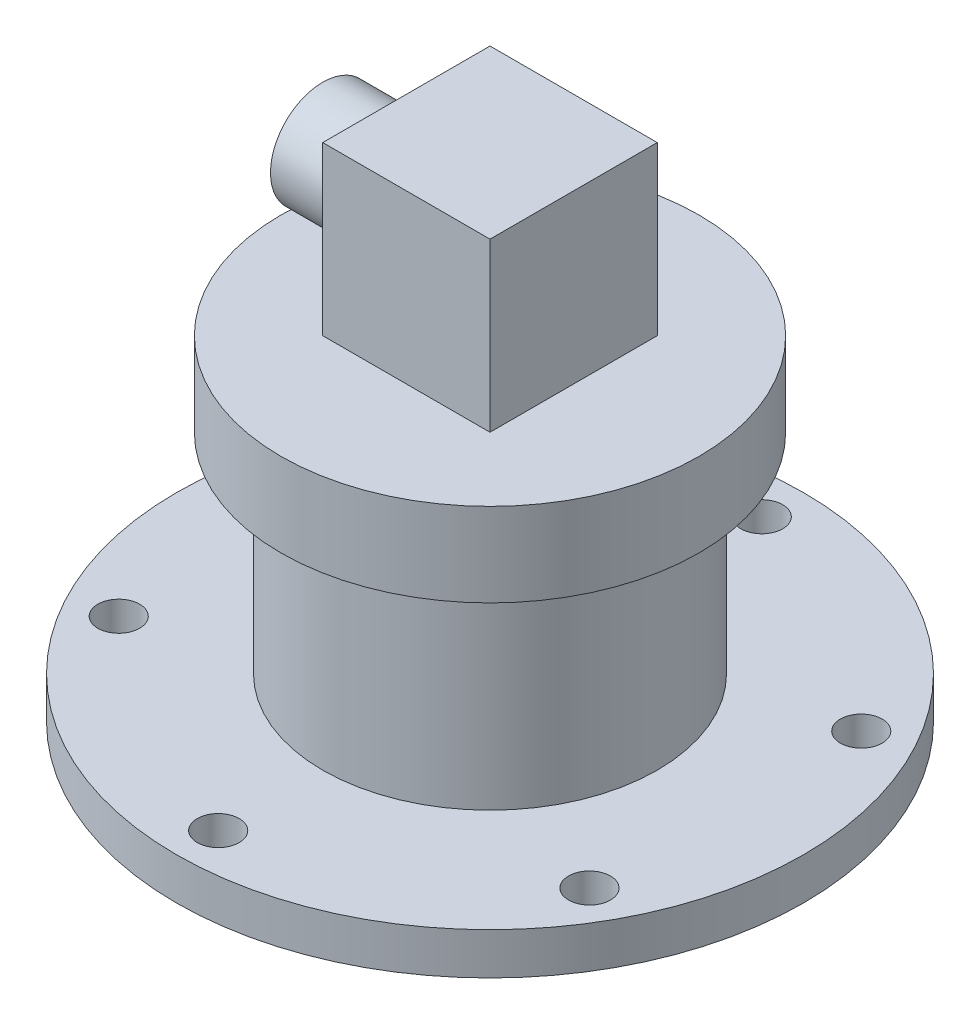
ISO-10303-21;
HEADER;
FILE_DESCRIPTION(('STEP AP214'),'2;1');
FILE_NAME('part.step','',(''),(''),'','','');
FILE_SCHEMA(('AUTOMOTIVE_DESIGN { 1 0 10303 214 1 1 1 1 }'));
ENDSEC;
DATA;
#1=APPLICATION_CONTEXT('core data for automotive mechanical design processes');
#2=APPLICATION_PROTOCOL_DEFINITION('international standard','automotive_design',2000,#1);
#3=PRODUCT_CONTEXT('',#1,'mechanical');
#4=PRODUCT('Part','Part','',(#3));
#5=PRODUCT_RELATED_PRODUCT_CATEGORY('part','',(#4));
#6=PRODUCT_DEFINITION_FORMATION('','',#4);
#7=PRODUCT_DEFINITION_CONTEXT('part definition',#1,'design');
#8=PRODUCT_DEFINITION('design','',#6,#7);
#9=PRODUCT_DEFINITION_SHAPE('','',#8);
#10=(LENGTH_UNIT() NAMED_UNIT(*) SI_UNIT(.MILLI.,.METRE.));
#11=(NAMED_UNIT(*) PLANE_ANGLE_UNIT() SI_UNIT($,.RADIAN.));
#12=(NAMED_UNIT(*) SI_UNIT($,.STERADIAN.) SOLID_ANGLE_UNIT());
#13=UNCERTAINTY_MEASURE_WITH_UNIT(LENGTH_MEASURE(1.E-05),#10,'distance_accuracy_value','');
#14=(GEOMETRIC_REPRESENTATION_CONTEXT(3) GLOBAL_UNCERTAINTY_ASSIGNED_CONTEXT((#13)) GLOBAL_UNIT_ASSIGNED_CONTEXT((#10,
#11,#12)) REPRESENTATION_CONTEXT('',''));
#15=CARTESIAN_POINT('',(0.,0.,0.));
#16=DIRECTION('',(0.,0.,1.));
#17=DIRECTION('',(1.,0.,0.));
#18=AXIS2_PLACEMENT_3D('',#15,#16,#17);
#19=CARTESIAN_POINT('',(0.,10.,0.));
#20=DIRECTION('',(0.,-1.,0.));
#21=DIRECTION('',(0.,0.,-1.));
#22=AXIS2_PLACEMENT_3D('',#19,#20,#21);
#23=CYLINDRICAL_SURFACE('',#22,75.);
#24=CARTESIAN_POINT('',(0.,10.,0.));
#25=DIRECTION('',(0.,1.,0.));
#26=DIRECTION('',(0.,0.,1.));
#27=AXIS2_PLACEMENT_3D('',#24,#25,#26);
#28=CIRCLE('',#27,75.);
#29=CARTESIAN_POINT('',(0.,10.,75.));
#30=VERTEX_POINT('',#29);
#31=EDGE_CURVE('E40',#30,#30,#28,.T.);
#32=ORIENTED_EDGE('',*,*,#31,.F.);
#33=EDGE_LOOP('',(#32));
#34=FACE_BOUND('',#33,.T.);
#35=CARTESIAN_POINT('',(0.,0.,0.));
#36=DIRECTION('',(0.,1.,0.));
#37=DIRECTION('',(0.,0.,1.));
#38=AXIS2_PLACEMENT_3D('',#35,#36,#37);
#39=CIRCLE('',#38,75.);
#40=CARTESIAN_POINT('',(0.,0.,75.));
#41=VERTEX_POINT('',#40);
#42=EDGE_CURVE('E114',#41,#41,#39,.T.);
#43=ORIENTED_EDGE('',*,*,#42,.T.);
#44=EDGE_LOOP('',(#43));
#45=FACE_BOUND('',#44,.T.);
#46=ADVANCED_FACE('F33',(#34,#45),#23,.T.);
#47=CARTESIAN_POINT('',(0.,10.,0.));
#48=DIRECTION('',(0.,1.,0.));
#49=DIRECTION('',(0.,0.,1.));
#50=AXIS2_PLACEMENT_3D('',#47,#48,#49);
#51=PLANE('',#50);
#52=CARTESIAN_POINT('',(0.,10.,0.));
#53=DIRECTION('',(0.,1.,0.));
#54=DIRECTION('',(0.,0.,1.));
#55=AXIS2_PLACEMENT_3D('',#52,#53,#54);
#56=CIRCLE('',#55,40.);
#57=CARTESIAN_POINT('',(0.,10.,40.));
#58=VERTEX_POINT('',#57);
#59=EDGE_CURVE('E103',#58,#58,#56,.T.);
#60=ORIENTED_EDGE('',*,*,#59,.F.);
#61=EDGE_LOOP('',(#60));
#62=FACE_BOUND('',#61,.T.);
#63=CARTESIAN_POINT('',(0.,10.,-65.));
#64=DIRECTION('',(0.,1.,0.));
#65=DIRECTION('',(0.,0.,1.));
#66=AXIS2_PLACEMENT_3D('',#63,#64,#65);
#67=CIRCLE('',#66,5.);
#68=CARTESIAN_POINT('',(0.,10.,-60.));
#69=VERTEX_POINT('',#68);
#70=EDGE_CURVE('E115',#69,#69,#67,.T.);
#71=ORIENTED_EDGE('',*,*,#70,.F.);
#72=EDGE_LOOP('',(#71));
#73=FACE_BOUND('',#72,.T.);
#74=CARTESIAN_POINT('',(-56.2916512459872,10.,-32.4999999999976));
#75=DIRECTION('',(0.,1.,0.));
#76=DIRECTION('',(0.,0.,1.));
#77=AXIS2_PLACEMENT_3D('',#74,#75,#76);
#78=CIRCLE('',#77,5.00000000000279);
#79=CARTESIAN_POINT('',(-56.2916512459872,10.,-27.4999999999948));
#80=VERTEX_POINT('',#79);
#81=EDGE_CURVE('E108',#80,#80,#78,.T.);
#82=ORIENTED_EDGE('',*,*,#81,.F.);
#83=EDGE_LOOP('',(#82));
#84=FACE_BOUND('',#83,.T.);
#85=CARTESIAN_POINT('',(-56.2916512459844,10.,32.5000000000024));
#86=DIRECTION('',(0.,1.,0.));
#87=DIRECTION('',(0.,0.,1.));
#88=AXIS2_PLACEMENT_3D('',#85,#86,#87);
#89=CIRCLE('',#88,5.00000000000526);
#90=CARTESIAN_POINT('',(-56.2916512459844,10.,37.5000000000077));
#91=VERTEX_POINT('',#90);
#92=EDGE_CURVE('E122',#91,#91,#89,.T.);
#93=ORIENTED_EDGE('',*,*,#92,.F.);
#94=EDGE_LOOP('',(#93));
#95=FACE_BOUND('',#94,.T.);
#96=CARTESIAN_POINT('',(5.51835272634541E-12,10.,65.));
#97=DIRECTION('',(0.,1.,0.));
#98=DIRECTION('',(0.,0.,1.));
#99=AXIS2_PLACEMENT_3D('',#96,#97,#98);
#100=CIRCLE('',#99,5.00000000000572);
#101=CARTESIAN_POINT('',(5.51835272634541E-12,10.,70.0000000000057));
#102=VERTEX_POINT('',#101);
#103=EDGE_CURVE('E139',#102,#102,#100,.T.);
#104=ORIENTED_EDGE('',*,*,#103,.F.);
#105=EDGE_LOOP('',(#104));
#106=FACE_BOUND('',#105,.T.);
#107=CARTESIAN_POINT('',(56.2916512459927,10.,32.4999999999976));
#108=DIRECTION('',(0.,1.,0.));
#109=DIRECTION('',(0.,0.,1.));
#110=AXIS2_PLACEMENT_3D('',#107,#108,#109);
#111=CIRCLE('',#110,5.00000000000356);
#112=CARTESIAN_POINT('',(56.2916512459927,10.,37.5000000000012));
#113=VERTEX_POINT('',#112);
#114=EDGE_CURVE('E133',#113,#113,#111,.T.);
#115=ORIENTED_EDGE('',*,*,#114,.F.);
#116=EDGE_LOOP('',(#115));
#117=FACE_BOUND('',#116,.T.);
#118=CARTESIAN_POINT('',(56.2916512459899,10.,-32.5000000000024));
#119=DIRECTION('',(0.,1.,0.));
#120=DIRECTION('',(0.,0.,1.));
#121=AXIS2_PLACEMENT_3D('',#118,#119,#120);
#122=CIRCLE('',#121,5.00000000000078);
#123=CARTESIAN_POINT('',(56.2916512459899,10.,-27.5000000000016));
#124=VERTEX_POINT('',#123);
#125=EDGE_CURVE('E127',#124,#124,#122,.T.);
#126=ORIENTED_EDGE('',*,*,#125,.F.);
#127=EDGE_LOOP('',(#126));
#128=FACE_BOUND('',#127,.T.);
#129=ORIENTED_EDGE('',*,*,#31,.T.);
#130=EDGE_LOOP('',(#129));
#131=FACE_BOUND('',#130,.T.);
#132=ADVANCED_FACE('F155',(#62,#73,#84,#95,#106,#117,#128,#131),#51,.T.);
#133=CARTESIAN_POINT('',(0.,0.,0.));
#134=DIRECTION('',(0.,1.,0.));
#135=DIRECTION('',(0.,0.,1.));
#136=AXIS2_PLACEMENT_3D('',#133,#134,#135);
#137=PLANE('',#136);
#138=CARTESIAN_POINT('',(0.,0.,-65.));
#139=DIRECTION('',(0.,1.,0.));
#140=DIRECTION('',(0.,0.,1.));
#141=AXIS2_PLACEMENT_3D('',#138,#139,#140);
#142=CIRCLE('',#141,5.);
#143=CARTESIAN_POINT('',(0.,0.,-60.));
#144=VERTEX_POINT('',#143);
#145=EDGE_CURVE('E111',#144,#144,#142,.T.);
#146=ORIENTED_EDGE('',*,*,#145,.T.);
#147=EDGE_LOOP('',(#146));
#148=FACE_BOUND('',#147,.T.);
#149=CARTESIAN_POINT('',(-56.2916512459872,0.,-32.4999999999976));
#150=DIRECTION('',(0.,1.,0.));
#151=DIRECTION('',(0.,0.,1.));
#152=AXIS2_PLACEMENT_3D('',#149,#150,#151);
#153=CIRCLE('',#152,5.00000000000279);
#154=CARTESIAN_POINT('',(-56.2916512459872,0.,-27.4999999999948));
#155=VERTEX_POINT('',#154);
#156=EDGE_CURVE('E119',#155,#155,#153,.T.);
#157=ORIENTED_EDGE('',*,*,#156,.T.);
#158=EDGE_LOOP('',(#157));
#159=FACE_BOUND('',#158,.T.);
#160=CARTESIAN_POINT('',(-56.2916512459844,0.,32.5000000000024));
#161=DIRECTION('',(0.,1.,0.));
#162=DIRECTION('',(0.,0.,1.));
#163=AXIS2_PLACEMENT_3D('',#160,#161,#162);
#164=CIRCLE('',#163,5.00000000000526);
#165=CARTESIAN_POINT('',(-56.2916512459844,0.,37.5000000000077));
#166=VERTEX_POINT('',#165);
#167=EDGE_CURVE('E142',#166,#166,#164,.T.);
#168=ORIENTED_EDGE('',*,*,#167,.T.);
#169=EDGE_LOOP('',(#168));
#170=FACE_BOUND('',#169,.T.);
#171=CARTESIAN_POINT('',(5.51835272634541E-12,0.,65.));
#172=DIRECTION('',(0.,1.,0.));
#173=DIRECTION('',(0.,0.,1.));
#174=AXIS2_PLACEMENT_3D('',#171,#172,#173);
#175=CIRCLE('',#174,5.00000000000572);
#176=CARTESIAN_POINT('',(5.51835272634541E-12,0.,70.0000000000057));
#177=VERTEX_POINT('',#176);
#178=EDGE_CURVE('E136',#177,#177,#175,.T.);
#179=ORIENTED_EDGE('',*,*,#178,.T.);
#180=EDGE_LOOP('',(#179));
#181=FACE_BOUND('',#180,.T.);
#182=CARTESIAN_POINT('',(56.2916512459927,0.,32.4999999999976));
#183=DIRECTION('',(0.,1.,0.));
#184=DIRECTION('',(0.,0.,1.));
#185=AXIS2_PLACEMENT_3D('',#182,#183,#184);
#186=CIRCLE('',#185,5.00000000000356);
#187=CARTESIAN_POINT('',(56.2916512459927,0.,37.5000000000012));
#188=VERTEX_POINT('',#187);
#189=EDGE_CURVE('E130',#188,#188,#186,.T.);
#190=ORIENTED_EDGE('',*,*,#189,.T.);
#191=EDGE_LOOP('',(#190));
#192=FACE_BOUND('',#191,.T.);
#193=CARTESIAN_POINT('',(56.2916512459899,0.,-32.5000000000024));
#194=DIRECTION('',(0.,1.,0.));
#195=DIRECTION('',(0.,0.,1.));
#196=AXIS2_PLACEMENT_3D('',#193,#194,#195);
#197=CIRCLE('',#196,5.00000000000078);
#198=CARTESIAN_POINT('',(56.2916512459899,0.,-27.5000000000016));
#199=VERTEX_POINT('',#198);
#200=EDGE_CURVE('E118',#199,#199,#197,.T.);
#201=ORIENTED_EDGE('',*,*,#200,.T.);
#202=EDGE_LOOP('',(#201));
#203=FACE_BOUND('',#202,.T.);
#204=ORIENTED_EDGE('',*,*,#42,.F.);
#205=EDGE_LOOP('',(#204));
#206=FACE_BOUND('',#205,.T.);
#207=ADVANCED_FACE('F152',(#148,#159,#170,#181,#192,#203,#206),#137,.F.);
#208=CARTESIAN_POINT('',(56.2916512459899,0.,-32.5000000000024));
#209=DIRECTION('',(0.,1.,0.));
#210=DIRECTION('',(0.,0.,1.));
#211=AXIS2_PLACEMENT_3D('',#208,#209,#210);
#212=CYLINDRICAL_SURFACE('',#211,5.00000000000078);
#213=ORIENTED_EDGE('',*,*,#200,.F.);
#214=EDGE_LOOP('',(#213));
#215=FACE_BOUND('',#214,.T.);
#216=ORIENTED_EDGE('',*,*,#125,.T.);
#217=EDGE_LOOP('',(#216));
#218=FACE_BOUND('',#217,.T.);
#219=ADVANCED_FACE('F154',(#215,#218),#212,.F.);
#220=CARTESIAN_POINT('',(56.2916512459927,0.,32.4999999999976));
#221=DIRECTION('',(0.,1.,0.));
#222=DIRECTION('',(0.,0.,1.));
#223=AXIS2_PLACEMENT_3D('',#220,#221,#222);
#224=CYLINDRICAL_SURFACE('',#223,5.00000000000356);
#225=ORIENTED_EDGE('',*,*,#189,.F.);
#226=EDGE_LOOP('',(#225));
#227=FACE_BOUND('',#226,.T.);
#228=ORIENTED_EDGE('',*,*,#114,.T.);
#229=EDGE_LOOP('',(#228));
#230=FACE_BOUND('',#229,.T.);
#231=ADVANCED_FACE('F161',(#227,#230),#224,.F.);
#232=CARTESIAN_POINT('',(5.51835272634541E-12,0.,65.));
#233=DIRECTION('',(0.,1.,0.));
#234=DIRECTION('',(0.,0.,1.));
#235=AXIS2_PLACEMENT_3D('',#232,#233,#234);
#236=CYLINDRICAL_SURFACE('',#235,5.00000000000572);
#237=ORIENTED_EDGE('',*,*,#178,.F.);
#238=EDGE_LOOP('',(#237));
#239=FACE_BOUND('',#238,.T.);
#240=ORIENTED_EDGE('',*,*,#103,.T.);
#241=EDGE_LOOP('',(#240));
#242=FACE_BOUND('',#241,.T.);
#243=ADVANCED_FACE('F322',(#239,#242),#236,.F.);
#244=CARTESIAN_POINT('',(-56.2916512459844,0.,32.5000000000024));
#245=DIRECTION('',(0.,1.,0.));
#246=DIRECTION('',(0.,0.,1.));
#247=AXIS2_PLACEMENT_3D('',#244,#245,#246);
#248=CYLINDRICAL_SURFACE('',#247,5.00000000000526);
#249=ORIENTED_EDGE('',*,*,#167,.F.);
#250=EDGE_LOOP('',(#249));
#251=FACE_BOUND('',#250,.T.);
#252=ORIENTED_EDGE('',*,*,#92,.T.);
#253=EDGE_LOOP('',(#252));
#254=FACE_BOUND('',#253,.T.);
#255=ADVANCED_FACE('F317',(#251,#254),#248,.F.);
#256=CARTESIAN_POINT('',(-56.2916512459872,0.,-32.4999999999976));
#257=DIRECTION('',(0.,1.,0.));
#258=DIRECTION('',(0.,0.,1.));
#259=AXIS2_PLACEMENT_3D('',#256,#257,#258);
#260=CYLINDRICAL_SURFACE('',#259,5.00000000000279);
#261=ORIENTED_EDGE('',*,*,#156,.F.);
#262=EDGE_LOOP('',(#261));
#263=FACE_BOUND('',#262,.T.);
#264=ORIENTED_EDGE('',*,*,#81,.T.);
#265=EDGE_LOOP('',(#264));
#266=FACE_BOUND('',#265,.T.);
#267=ADVANCED_FACE('F314',(#263,#266),#260,.F.);
#268=CARTESIAN_POINT('',(0.,0.,-65.));
#269=DIRECTION('',(0.,1.,0.));
#270=DIRECTION('',(0.,0.,1.));
#271=AXIS2_PLACEMENT_3D('',#268,#269,#270);
#272=CYLINDRICAL_SURFACE('',#271,5.);
#273=ORIENTED_EDGE('',*,*,#145,.F.);
#274=EDGE_LOOP('',(#273));
#275=FACE_BOUND('',#274,.T.);
#276=ORIENTED_EDGE('',*,*,#70,.T.);
#277=EDGE_LOOP('',(#276));
#278=FACE_BOUND('',#277,.T.);
#279=ADVANCED_FACE('F184',(#275,#278),#272,.F.);
#280=CARTESIAN_POINT('',(0.,60.,0.));
#281=DIRECTION('',(0.,-1.,0.));
#282=DIRECTION('',(0.,0.,-1.));
#283=AXIS2_PLACEMENT_3D('',#280,#281,#282);
#284=CYLINDRICAL_SURFACE('',#283,40.);
#285=CARTESIAN_POINT('',(0.,60.,0.));
#286=DIRECTION('',(0.,1.,0.));
#287=DIRECTION('',(0.,0.,1.));
#288=AXIS2_PLACEMENT_3D('',#285,#286,#287);
#289=CIRCLE('',#288,40.);
#290=CARTESIAN_POINT('',(0.,60.,40.));
#291=VERTEX_POINT('',#290);
#292=EDGE_CURVE('E105',#291,#291,#289,.T.);
#293=ORIENTED_EDGE('',*,*,#292,.F.);
#294=EDGE_LOOP('',(#293));
#295=FACE_BOUND('',#294,.T.);
#296=ORIENTED_EDGE('',*,*,#59,.T.);
#297=EDGE_LOOP('',(#296));
#298=FACE_BOUND('',#297,.T.);
#299=ADVANCED_FACE('F189',(#295,#298),#284,.T.);
#300=CARTESIAN_POINT('',(0.,80.,0.));
#301=DIRECTION('',(0.,-1.,0.));
#302=DIRECTION('',(0.,0.,-1.));
#303=AXIS2_PLACEMENT_3D('',#300,#301,#302);
#304=CYLINDRICAL_SURFACE('',#303,50.);
#305=CARTESIAN_POINT('',(0.,80.,0.));
#306=DIRECTION('',(0.,1.,0.));
#307=DIRECTION('',(0.,0.,1.));
#308=AXIS2_PLACEMENT_3D('',#305,#306,#307);
#309=CIRCLE('',#308,50.);
#310=CARTESIAN_POINT('',(0.,80.,50.));
#311=VERTEX_POINT('',#310);
#312=EDGE_CURVE('E96',#311,#311,#309,.T.);
#313=ORIENTED_EDGE('',*,*,#312,.F.);
#314=EDGE_LOOP('',(#313));
#315=FACE_BOUND('',#314,.T.);
#316=CARTESIAN_POINT('',(0.,60.,0.));
#317=DIRECTION('',(0.,1.,0.));
#318=DIRECTION('',(0.,0.,1.));
#319=AXIS2_PLACEMENT_3D('',#316,#317,#318);
#320=CIRCLE('',#319,50.);
#321=CARTESIAN_POINT('',(0.,60.,50.));
#322=VERTEX_POINT('',#321);
#323=EDGE_CURVE('E93',#322,#322,#320,.T.);
#324=ORIENTED_EDGE('',*,*,#323,.T.);
#325=EDGE_LOOP('',(#324));
#326=FACE_BOUND('',#325,.T.);
#327=ADVANCED_FACE('F194',(#315,#326),#304,.T.);
#328=CARTESIAN_POINT('',(0.,80.,0.));
#329=DIRECTION('',(0.,1.,0.));
#330=DIRECTION('',(0.,0.,1.));
#331=AXIS2_PLACEMENT_3D('',#328,#329,#330);
#332=PLANE('',#331);
#333=DIRECTION('',(0.,0.,-1.));
#334=VECTOR('',#333,1.);
#335=CARTESIAN_POINT('',(20.,80.,-20.));
#336=LINE('',#335,#334);
#337=CARTESIAN_POINT('',(20.,80.,20.));
#338=VERTEX_POINT('',#337);
#339=CARTESIAN_POINT('',(20.,80.,-20.));
#340=VERTEX_POINT('',#339);
#341=EDGE_CURVE('E47',#338,#340,#336,.T.);
#342=ORIENTED_EDGE('',*,*,#341,.F.);
#343=DIRECTION('',(1.,0.,0.));
#344=VECTOR('',#343,1.);
#345=CARTESIAN_POINT('',(-20.,80.,20.));
#346=LINE('',#345,#344);
#347=CARTESIAN_POINT('',(-20.,80.,20.));
#348=VERTEX_POINT('',#347);
#349=EDGE_CURVE('E51',#348,#338,#346,.T.);
#350=ORIENTED_EDGE('',*,*,#349,.F.);
#351=DIRECTION('',(0.,0.,1.));
#352=VECTOR('',#351,1.);
#353=CARTESIAN_POINT('',(-20.,80.,-20.));
#354=LINE('',#353,#352);
#355=CARTESIAN_POINT('',(-20.,80.,-20.));
#356=VERTEX_POINT('',#355);
#357=EDGE_CURVE('E408',#356,#348,#354,.T.);
#358=ORIENTED_EDGE('',*,*,#357,.F.);
#359=DIRECTION('',(-1.,0.,0.));
#360=VECTOR('',#359,1.);
#361=CARTESIAN_POINT('',(-20.,80.,-20.));
#362=LINE('',#361,#360);
#363=EDGE_CURVE('E406',#340,#356,#362,.T.);
#364=ORIENTED_EDGE('',*,*,#363,.F.);
#365=EDGE_LOOP('',(#342,#350,#358,#364));
#366=FACE_BOUND('',#365,.T.);
#367=ORIENTED_EDGE('',*,*,#312,.T.);
#368=EDGE_LOOP('',(#367));
#369=FACE_BOUND('',#368,.T.);
#370=ADVANCED_FACE('F204',(#366,#369),#332,.T.);
#371=CARTESIAN_POINT('',(0.,60.,0.));
#372=DIRECTION('',(0.,1.,0.));
#373=DIRECTION('',(0.,0.,1.));
#374=AXIS2_PLACEMENT_3D('',#371,#372,#373);
#375=PLANE('',#374);
#376=ORIENTED_EDGE('',*,*,#292,.T.);
#377=EDGE_LOOP('',(#376));
#378=FACE_BOUND('',#377,.T.);
#379=ORIENTED_EDGE('',*,*,#323,.F.);
#380=EDGE_LOOP('',(#379));
#381=FACE_BOUND('',#380,.T.);
#382=ADVANCED_FACE('F212',(#378,#381),#375,.F.);
#383=CARTESIAN_POINT('',(20.,120.,-20.));
#384=DIRECTION('',(-1.,0.,0.));
#385=DIRECTION('',(0.,0.,1.));
#386=AXIS2_PLACEMENT_3D('',#383,#384,#385);
#387=PLANE('',#386);
#388=ORIENTED_EDGE('',*,*,#341,.T.);
#389=DIRECTION('',(0.,-1.,0.));
#390=VECTOR('',#389,1.);
#391=CARTESIAN_POINT('',(20.,120.,-20.));
#392=LINE('',#391,#390);
#393=CARTESIAN_POINT('',(20.,120.,-20.));
#394=VERTEX_POINT('',#393);
#395=EDGE_CURVE('E76',#394,#340,#392,.T.);
#396=ORIENTED_EDGE('',*,*,#395,.F.);
#397=DIRECTION('',(0.,0.,-1.));
#398=VECTOR('',#397,1.);
#399=CARTESIAN_POINT('',(20.,120.,-20.));
#400=LINE('',#399,#398);
#401=CARTESIAN_POINT('',(20.,120.,20.));
#402=VERTEX_POINT('',#401);
#403=EDGE_CURVE('E82',#402,#394,#400,.T.);
#404=ORIENTED_EDGE('',*,*,#403,.F.);
#405=DIRECTION('',(0.,-1.,0.));
#406=VECTOR('',#405,1.);
#407=CARTESIAN_POINT('',(20.,120.,20.));
#408=LINE('',#407,#406);
#409=EDGE_CURVE('E404',#402,#338,#408,.T.);
#410=ORIENTED_EDGE('',*,*,#409,.T.);
#411=EDGE_LOOP('',(#388,#396,#404,#410));
#412=FACE_BOUND('',#411,.T.);
#413=ADVANCED_FACE('F92',(#412),#387,.F.);
#414=CARTESIAN_POINT('',(-20.,120.,-20.));
#415=DIRECTION('',(0.,0.,1.));
#416=DIRECTION('',(1.,0.,0.));
#417=AXIS2_PLACEMENT_3D('',#414,#415,#416);
#418=PLANE('',#417);
#419=ORIENTED_EDGE('',*,*,#363,.T.);
#420=DIRECTION('',(0.,-1.,0.));
#421=VECTOR('',#420,1.);
#422=CARTESIAN_POINT('',(-20.,120.,-20.));
#423=LINE('',#422,#421);
#424=CARTESIAN_POINT('',(-20.,120.,-20.));
#425=VERTEX_POINT('',#424);
#426=EDGE_CURVE('E78',#425,#356,#423,.T.);
#427=ORIENTED_EDGE('',*,*,#426,.F.);
#428=DIRECTION('',(-1.,0.,0.));
#429=VECTOR('',#428,1.);
#430=CARTESIAN_POINT('',(-20.,120.,-20.));
#431=LINE('',#430,#429);
#432=EDGE_CURVE('E71',#394,#425,#431,.T.);
#433=ORIENTED_EDGE('',*,*,#432,.F.);
#434=ORIENTED_EDGE('',*,*,#395,.T.);
#435=EDGE_LOOP('',(#419,#427,#433,#434));
#436=FACE_BOUND('',#435,.T.);
#437=ADVANCED_FACE('F74',(#436),#418,.F.);
#438=CARTESIAN_POINT('',(-20.,120.,-20.));
#439=DIRECTION('',(1.,0.,0.));
#440=DIRECTION('',(0.,0.,-1.));
#441=AXIS2_PLACEMENT_3D('',#438,#439,#440);
#442=PLANE('',#441);
#443=CARTESIAN_POINT('',(-20.,100.,0.));
#444=DIRECTION('',(1.,0.,0.));
#445=DIRECTION('',(0.,0.,-1.));
#446=AXIS2_PLACEMENT_3D('',#443,#444,#445);
#447=CIRCLE('',#446,12.5);
#448=CARTESIAN_POINT('',(-20.,100.,-12.5));
#449=VERTEX_POINT('',#448);
#450=EDGE_CURVE('E11',#449,#449,#447,.F.);
#451=ORIENTED_EDGE('',*,*,#450,.F.);
#452=EDGE_LOOP('',(#451));
#453=FACE_BOUND('',#452,.T.);
#454=ORIENTED_EDGE('',*,*,#357,.T.);
#455=DIRECTION('',(0.,-1.,0.));
#456=VECTOR('',#455,1.);
#457=CARTESIAN_POINT('',(-20.,120.,20.));
#458=LINE('',#457,#456);
#459=CARTESIAN_POINT('',(-20.,120.,20.));
#460=VERTEX_POINT('',#459);
#461=EDGE_CURVE('E98',#460,#348,#458,.T.);
#462=ORIENTED_EDGE('',*,*,#461,.F.);
#463=DIRECTION('',(0.,0.,1.));
#464=VECTOR('',#463,1.);
#465=CARTESIAN_POINT('',(-20.,120.,-20.));
#466=LINE('',#465,#464);
#467=EDGE_CURVE('E81',#425,#460,#466,.T.);
#468=ORIENTED_EDGE('',*,*,#467,.F.);
#469=ORIENTED_EDGE('',*,*,#426,.T.);
#470=EDGE_LOOP('',(#454,#462,#468,#469));
#471=FACE_BOUND('',#470,.T.);
#472=ADVANCED_FACE('F240',(#453,#471),#442,.F.);
#473=CARTESIAN_POINT('',(-20.,120.,20.));
#474=DIRECTION('',(0.,0.,-1.));
#475=DIRECTION('',(-1.,0.,0.));
#476=AXIS2_PLACEMENT_3D('',#473,#474,#475);
#477=PLANE('',#476);
#478=ORIENTED_EDGE('',*,*,#349,.T.);
#479=ORIENTED_EDGE('',*,*,#409,.F.);
#480=DIRECTION('',(1.,0.,0.));
#481=VECTOR('',#480,1.);
#482=CARTESIAN_POINT('',(-20.,120.,20.));
#483=LINE('',#482,#481);
#484=EDGE_CURVE('E87',#460,#402,#483,.T.);
#485=ORIENTED_EDGE('',*,*,#484,.F.);
#486=ORIENTED_EDGE('',*,*,#461,.T.);
#487=EDGE_LOOP('',(#478,#479,#485,#486));
#488=FACE_BOUND('',#487,.T.);
#489=ADVANCED_FACE('F247',(#488),#477,.F.);
#490=CARTESIAN_POINT('',(0.,120.,0.));
#491=DIRECTION('',(0.,1.,0.));
#492=DIRECTION('',(0.,0.,1.));
#493=AXIS2_PLACEMENT_3D('',#490,#491,#492);
#494=PLANE('',#493);
#495=ORIENTED_EDGE('',*,*,#403,.T.);
#496=ORIENTED_EDGE('',*,*,#432,.T.);
#497=ORIENTED_EDGE('',*,*,#467,.T.);
#498=ORIENTED_EDGE('',*,*,#484,.T.);
#499=EDGE_LOOP('',(#495,#496,#497,#498));
#500=FACE_BOUND('',#499,.T.);
#501=ADVANCED_FACE('F85',(#500),#494,.T.);
#502=CARTESIAN_POINT('',(-40.,100.,0.));
#503=DIRECTION('',(1.,0.,0.));
#504=DIRECTION('',(0.,0.,-1.));
#505=AXIS2_PLACEMENT_3D('',#502,#503,#504);
#506=CYLINDRICAL_SURFACE('',#505,12.5);
#507=CARTESIAN_POINT('',(-40.,100.,0.));
#508=DIRECTION('',(-1.,0.,0.));
#509=DIRECTION('',(0.,0.,1.));
#510=AXIS2_PLACEMENT_3D('',#507,#508,#509);
#511=CIRCLE('',#510,12.5);
#512=CARTESIAN_POINT('',(-40.,100.,12.5));
#513=VERTEX_POINT('',#512);
#514=EDGE_CURVE('E394',#513,#513,#511,.T.);
#515=ORIENTED_EDGE('',*,*,#514,.F.);
#516=EDGE_LOOP('',(#515));
#517=FACE_BOUND('',#516,.T.);
#518=ORIENTED_EDGE('',*,*,#450,.T.);
#519=EDGE_LOOP('',(#518));
#520=FACE_BOUND('',#519,.T.);
#521=ADVANCED_FACE('F261',(#517,#520),#506,.T.);
#522=CARTESIAN_POINT('',(-40.,100.,0.));
#523=DIRECTION('',(-1.,0.,0.));
#524=DIRECTION('',(0.,0.,1.));
#525=AXIS2_PLACEMENT_3D('',#522,#523,#524);
#526=PLANE('',#525);
#527=CARTESIAN_POINT('',(-40.,100.,0.));
#528=DIRECTION('',(-1.,0.,0.));
#529=DIRECTION('',(0.,0.,1.));
#530=AXIS2_PLACEMENT_3D('',#527,#528,#529);
#531=CIRCLE('',#530,7.5);
#532=CARTESIAN_POINT('',(-40.,100.,7.50000000000001));
#533=VERTEX_POINT('',#532);
#534=EDGE_CURVE('E395',#533,#533,#531,.T.);
#535=ORIENTED_EDGE('',*,*,#534,.F.);
#536=EDGE_LOOP('',(#535));
#537=FACE_BOUND('',#536,.T.);
#538=ORIENTED_EDGE('',*,*,#514,.T.);
#539=EDGE_LOOP('',(#538));
#540=FACE_BOUND('',#539,.T.);
#541=ADVANCED_FACE('F277',(#537,#540),#526,.T.);
#542=CARTESIAN_POINT('',(-25.,100.,0.));
#543=DIRECTION('',(-1.,0.,0.));
#544=DIRECTION('',(0.,0.,1.));
#545=AXIS2_PLACEMENT_3D('',#542,#543,#544);
#546=CYLINDRICAL_SURFACE('',#545,7.5);
#547=CARTESIAN_POINT('',(-25.,100.,0.));
#548=DIRECTION('',(-1.,0.,0.));
#549=DIRECTION('',(0.,0.,1.));
#550=AXIS2_PLACEMENT_3D('',#547,#548,#549);
#551=CIRCLE('',#550,7.5);
#552=CARTESIAN_POINT('',(-25.,100.,7.5));
#553=VERTEX_POINT('',#552);
#554=EDGE_CURVE('E393',#553,#553,#551,.T.);
#555=ORIENTED_EDGE('',*,*,#554,.F.);
#556=EDGE_LOOP('',(#555));
#557=FACE_BOUND('',#556,.T.);
#558=ORIENTED_EDGE('',*,*,#534,.T.);
#559=EDGE_LOOP('',(#558));
#560=FACE_BOUND('',#559,.T.);
#561=ADVANCED_FACE('F287',(#557,#560),#546,.F.);
#562=CARTESIAN_POINT('',(-25.,100.,0.));
#563=DIRECTION('',(-1.,0.,0.));
#564=DIRECTION('',(0.,0.,1.));
#565=AXIS2_PLACEMENT_3D('',#562,#563,#564);
#566=PLANE('',#565);
#567=ORIENTED_EDGE('',*,*,#554,.T.);
#568=EDGE_LOOP('',(#567));
#569=FACE_BOUND('',#568,.T.);
#570=ADVANCED_FACE('F297',(#569),#566,.T.);
#571=CLOSED_SHELL('',(#46,#132,#207,#219,#231,#243,#255,#267,#279,#299,#327,#370,#382,#413,#437,
#472,#489,#501,#521,#541,#561,#570));
#572=MANIFOLD_SOLID_BREP('B2',#571);
#573=ADVANCED_BREP_SHAPE_REPRESENTATION('',(#18,#572),#14);
#574=SHAPE_DEFINITION_REPRESENTATION(#9,#573);
ENDSEC;
END-ISO-10303-21;
